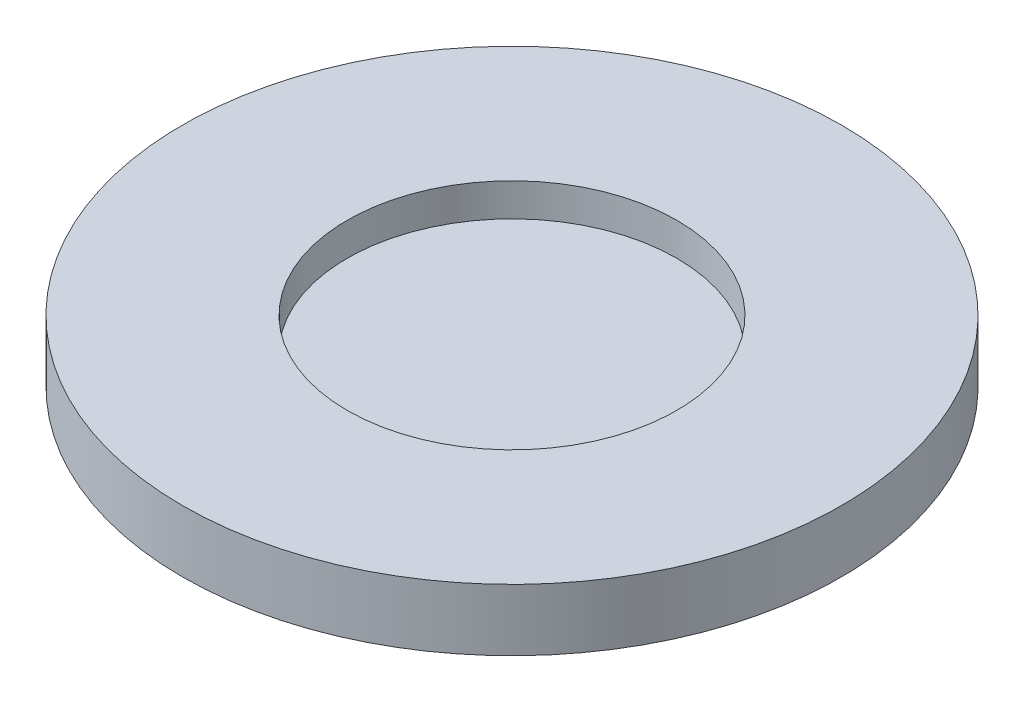
ISO-10303-21;
HEADER;
FILE_DESCRIPTION(('STEP AP214'),'2;1');
FILE_NAME('part.step','',(''),(''),'','','');
FILE_SCHEMA(('AUTOMOTIVE_DESIGN { 1 0 10303 214 1 1 1 1 }'));
ENDSEC;
DATA;
#1=APPLICATION_CONTEXT('core data for automotive mechanical design processes');
#2=APPLICATION_PROTOCOL_DEFINITION('international standard','automotive_design',2000,#1);
#3=PRODUCT_CONTEXT('',#1,'mechanical');
#4=PRODUCT('Part','Part','',(#3));
#5=PRODUCT_RELATED_PRODUCT_CATEGORY('part','',(#4));
#6=PRODUCT_DEFINITION_FORMATION('','',#4);
#7=PRODUCT_DEFINITION_CONTEXT('part definition',#1,'design');
#8=PRODUCT_DEFINITION('design','',#6,#7);
#9=PRODUCT_DEFINITION_SHAPE('','',#8);
#10=(LENGTH_UNIT() NAMED_UNIT(*) SI_UNIT(.MILLI.,.METRE.));
#11=(NAMED_UNIT(*) PLANE_ANGLE_UNIT() SI_UNIT($,.RADIAN.));
#12=(NAMED_UNIT(*) SI_UNIT($,.STERADIAN.) SOLID_ANGLE_UNIT());
#13=UNCERTAINTY_MEASURE_WITH_UNIT(LENGTH_MEASURE(1.E-05),#10,'distance_accuracy_value','');
#14=(GEOMETRIC_REPRESENTATION_CONTEXT(3) GLOBAL_UNCERTAINTY_ASSIGNED_CONTEXT((#13)) GLOBAL_UNIT_ASSIGNED_CONTEXT((#10,
#11,#12)) REPRESENTATION_CONTEXT('',''));
#15=CARTESIAN_POINT('',(0.,0.,0.));
#16=DIRECTION('',(0.,0.,1.));
#17=DIRECTION('',(1.,0.,0.));
#18=AXIS2_PLACEMENT_3D('',#15,#16,#17);
#19=CARTESIAN_POINT('',(0.,4.7625,0.));
#20=DIRECTION('',(0.,-1.,0.));
#21=DIRECTION('',(0.,0.,-1.));
#22=AXIS2_PLACEMENT_3D('',#19,#20,#21);
#23=CYLINDRICAL_SURFACE('',#22,25.4);
#24=CARTESIAN_POINT('',(0.,4.7625,0.));
#25=DIRECTION('',(0.,1.,0.));
#26=DIRECTION('',(0.,0.,1.));
#27=AXIS2_PLACEMENT_3D('',#24,#25,#26);
#28=CIRCLE('',#27,25.4);
#29=CARTESIAN_POINT('',(0.,4.7625,-25.4));
#30=VERTEX_POINT('',#29);
#31=EDGE_CURVE('E10',#30,#30,#28,.T.);
#32=CARTESIAN_POINT('',(0.,0.,0.));
#33=DIRECTION('',(0.,1.,0.));
#34=DIRECTION('',(0.,0.,1.));
#35=AXIS2_PLACEMENT_3D('',#32,#33,#34);
#36=CIRCLE('',#35,25.4);
#37=CARTESIAN_POINT('',(0.,0.,-25.4));
#38=VERTEX_POINT('',#37);
#39=EDGE_CURVE('E36',#38,#38,#36,.T.);
#40=CARTESIAN_POINT('',(0.,4.7625,-25.4));
#41=CARTESIAN_POINT('',(0.,4.712890625,-25.4));
#42=CARTESIAN_POINT('',(0.,4.66328125,-25.4));
#43=CARTESIAN_POINT('',(0.,4.5640625,-25.4));
#44=CARTESIAN_POINT('',(0.,4.514453125,-25.4));
#45=CARTESIAN_POINT('',(0.,4.415234375,-25.4));
#46=CARTESIAN_POINT('',(0.,4.365625,-25.4));
#47=CARTESIAN_POINT('',(0.,4.26640625,-25.4));
#48=CARTESIAN_POINT('',(0.,4.216796875,-25.4));
#49=CARTESIAN_POINT('',(0.,4.117578125,-25.4));
#50=CARTESIAN_POINT('',(0.,4.06796875,-25.4));
#51=CARTESIAN_POINT('',(0.,3.96875,-25.4));
#52=CARTESIAN_POINT('',(0.,3.919140625,-25.4));
#53=CARTESIAN_POINT('',(0.,3.819921875,-25.4));
#54=CARTESIAN_POINT('',(0.,3.7703125,-25.4));
#55=CARTESIAN_POINT('',(0.,3.67109375,-25.4));
#56=CARTESIAN_POINT('',(0.,3.621484375,-25.4));
#57=CARTESIAN_POINT('',(0.,3.522265625,-25.4));
#58=CARTESIAN_POINT('',(0.,3.47265625,-25.4));
#59=CARTESIAN_POINT('',(0.,3.3734375,-25.4));
#60=CARTESIAN_POINT('',(0.,3.323828125,-25.4));
#61=CARTESIAN_POINT('',(0.,3.224609375,-25.4));
#62=CARTESIAN_POINT('',(0.,3.175,-25.4));
#63=CARTESIAN_POINT('',(0.,3.07578125,-25.4));
#64=CARTESIAN_POINT('',(0.,3.026171875,-25.4));
#65=CARTESIAN_POINT('',(0.,2.926953125,-25.4));
#66=CARTESIAN_POINT('',(0.,2.87734375,-25.4));
#67=CARTESIAN_POINT('',(0.,2.778125,-25.4));
#68=CARTESIAN_POINT('',(0.,2.728515625,-25.4));
#69=CARTESIAN_POINT('',(0.,2.629296875,-25.4));
#70=CARTESIAN_POINT('',(0.,2.5796875,-25.4));
#71=CARTESIAN_POINT('',(0.,2.48046875,-25.4));
#72=CARTESIAN_POINT('',(0.,2.430859375,-25.4));
#73=CARTESIAN_POINT('',(0.,2.331640625,-25.4));
#74=CARTESIAN_POINT('',(0.,2.28203125,-25.4));
#75=CARTESIAN_POINT('',(0.,2.1828125,-25.4));
#76=CARTESIAN_POINT('',(0.,2.133203125,-25.4));
#77=CARTESIAN_POINT('',(0.,2.033984375,-25.4));
#78=CARTESIAN_POINT('',(0.,1.984375,-25.4));
#79=CARTESIAN_POINT('',(0.,1.88515625,-25.4));
#80=CARTESIAN_POINT('',(0.,1.835546875,-25.4));
#81=CARTESIAN_POINT('',(0.,1.736328125,-25.4));
#82=CARTESIAN_POINT('',(0.,1.68671875,-25.4));
#83=CARTESIAN_POINT('',(0.,1.5875,-25.4));
#84=CARTESIAN_POINT('',(0.,1.537890625,-25.4));
#85=CARTESIAN_POINT('',(0.,1.438671875,-25.4));
#86=CARTESIAN_POINT('',(0.,1.3890625,-25.4));
#87=CARTESIAN_POINT('',(0.,1.28984375,-25.4));
#88=CARTESIAN_POINT('',(0.,1.240234375,-25.4));
#89=CARTESIAN_POINT('',(0.,1.141015625,-25.4));
#90=CARTESIAN_POINT('',(0.,1.09140625,-25.4));
#91=CARTESIAN_POINT('',(0.,0.9921875,-25.4));
#92=CARTESIAN_POINT('',(0.,0.942578125,-25.4));
#93=CARTESIAN_POINT('',(0.,0.843359375,-25.4));
#94=CARTESIAN_POINT('',(0.,0.79375,-25.4));
#95=CARTESIAN_POINT('',(0.,0.69453125,-25.4));
#96=CARTESIAN_POINT('',(0.,0.644921875,-25.4));
#97=CARTESIAN_POINT('',(0.,0.545703125,-25.4));
#98=CARTESIAN_POINT('',(0.,0.49609375,-25.4));
#99=CARTESIAN_POINT('',(0.,0.396875,-25.4));
#100=CARTESIAN_POINT('',(0.,0.347265625,-25.4));
#101=CARTESIAN_POINT('',(0.,0.248046875,-25.4));
#102=CARTESIAN_POINT('',(0.,0.1984375,-25.4));
#103=CARTESIAN_POINT('',(0.,0.09921875,-25.4));
#104=CARTESIAN_POINT('',(0.,0.049609375,-25.4));
#105=CARTESIAN_POINT('',(0.,0.,-25.4));
#106=B_SPLINE_CURVE_WITH_KNOTS('',3,(#40,#41,#42,#43,#44,#45,#46,#47,#48,#49,#50,#51,#52,#53,
#54,#55,#56,#57,#58,#59,#60,#61,#62,#63,#64,#65,#66,#67,#68,#69,#70,#71,#72,#73,#74,#75,#76,#77,
#78,#79,#80,#81,#82,#83,#84,#85,#86,#87,#88,#89,#90,#91,#92,#93,#94,#95,#96,#97,#98,#99,#100,
#101,#102,#103,#104,#105),.UNSPECIFIED.,.F.,.F.,(4,2,2,2,2,2,2,2,2,2,2,2,2,2,2,2,2,2,2,2,2,2,2,
2,2,2,2,2,2,2,2,2,4),(0.,0.148828124999999,0.297656249999999,0.446484374999999,
0.595312499999999,0.744140625,0.89296875,1.041796875,1.190625,1.339453125,1.48828125,
1.637109375,1.7859375,1.934765625,2.08359375,2.232421875,2.38125,2.530078125,2.67890625,
2.827734375,2.9765625,3.125390625,3.27421875,3.423046875,3.571875,3.720703125,3.86953125,
4.018359375,4.1671875,4.316015625,4.46484375,4.613671875,4.7625),.UNSPECIFIED.);
#107=EDGE_CURVE('BSEAM33',#30,#38,#106,.T.);
#108=ORIENTED_EDGE('',*,*,#31,.F.);
#109=ORIENTED_EDGE('',*,*,#39,.T.);
#110=ORIENTED_EDGE('',*,*,#107,.T.);
#111=ORIENTED_EDGE('',*,*,#107,.F.);
#112=EDGE_LOOP('',(#108,#110,#109,#111));
#113=FACE_BOUND('',#112,.T.);
#114=ADVANCED_FACE('F33',(#113),#23,.T.);
#115=CARTESIAN_POINT('',(0.,4.7625,0.));
#116=DIRECTION('',(0.,1.,0.));
#117=DIRECTION('',(0.,0.,1.));
#118=AXIS2_PLACEMENT_3D('',#115,#116,#117);
#119=PLANE('',#118);
#120=CARTESIAN_POINT('',(0.,4.7625,0.));
#121=DIRECTION('',(0.,1.,0.));
#122=DIRECTION('',(0.,0.,1.));
#123=AXIS2_PLACEMENT_3D('',#120,#121,#122);
#124=CIRCLE('',#123,12.7);
#125=CARTESIAN_POINT('',(0.,4.7625,12.7));
#126=VERTEX_POINT('',#125);
#127=EDGE_CURVE('E45',#126,#126,#124,.T.);
#128=ORIENTED_EDGE('',*,*,#127,.F.);
#129=EDGE_LOOP('',(#128));
#130=FACE_BOUND('',#129,.T.);
#131=ORIENTED_EDGE('',*,*,#31,.T.);
#132=EDGE_LOOP('',(#131));
#133=FACE_BOUND('',#132,.T.);
#134=ADVANCED_FACE('F60',(#130,#133),#119,.T.);
#135=CARTESIAN_POINT('',(0.,0.,0.));
#136=DIRECTION('',(0.,1.,0.));
#137=DIRECTION('',(0.,0.,1.));
#138=AXIS2_PLACEMENT_3D('',#135,#136,#137);
#139=PLANE('',#138);
#140=ORIENTED_EDGE('',*,*,#39,.F.);
#141=EDGE_LOOP('',(#140));
#142=FACE_BOUND('',#141,.T.);
#143=ADVANCED_FACE('F56',(#142),#139,.F.);
#144=CARTESIAN_POINT('',(0.,2.2225,0.));
#145=DIRECTION('',(0.,1.,0.));
#146=DIRECTION('',(0.,0.,1.));
#147=AXIS2_PLACEMENT_3D('',#144,#145,#146);
#148=CYLINDRICAL_SURFACE('',#147,12.7);
#149=CARTESIAN_POINT('',(0.,2.2225,0.));
#150=DIRECTION('',(0.,1.,0.));
#151=DIRECTION('',(0.,0.,1.));
#152=AXIS2_PLACEMENT_3D('',#149,#150,#151);
#153=CIRCLE('',#152,12.7);
#154=CARTESIAN_POINT('',(0.,2.2225,12.7));
#155=VERTEX_POINT('',#154);
#156=EDGE_CURVE('E43',#155,#155,#153,.T.);
#157=ORIENTED_EDGE('',*,*,#156,.F.);
#158=EDGE_LOOP('',(#157));
#159=FACE_BOUND('',#158,.T.);
#160=ORIENTED_EDGE('',*,*,#127,.T.);
#161=EDGE_LOOP('',(#160));
#162=FACE_BOUND('',#161,.T.);
#163=ADVANCED_FACE('F53',(#159,#162),#148,.F.);
#164=CARTESIAN_POINT('',(0.,2.2225,0.));
#165=DIRECTION('',(0.,1.,0.));
#166=DIRECTION('',(0.,0.,1.));
#167=AXIS2_PLACEMENT_3D('',#164,#165,#166);
#168=PLANE('',#167);
#169=ORIENTED_EDGE('',*,*,#156,.T.);
#170=EDGE_LOOP('',(#169));
#171=FACE_BOUND('',#170,.T.);
#172=ADVANCED_FACE('F51',(#171),#168,.T.);
#173=CLOSED_SHELL('',(#114,#134,#143,#163,#172));
#174=MANIFOLD_SOLID_BREP('B2',#173);
#175=ADVANCED_BREP_SHAPE_REPRESENTATION('',(#18,#174),#14);
#176=SHAPE_DEFINITION_REPRESENTATION(#9,#175);
ENDSEC;
END-ISO-10303-21;
